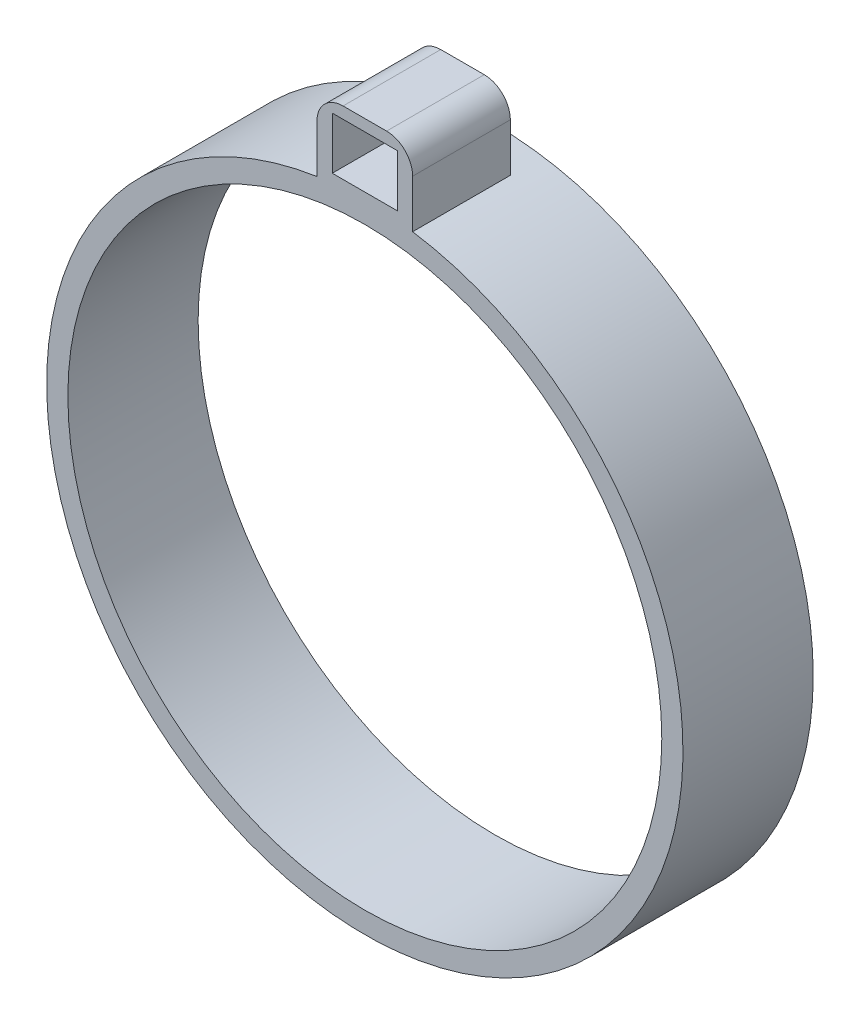
ISO-10303-21;
HEADER;
FILE_DESCRIPTION(('STEP AP214'),'2;1');
FILE_NAME('part.step','',(''),(''),'','','');
FILE_SCHEMA(('AUTOMOTIVE_DESIGN { 1 0 10303 214 1 1 1 1 }'));
ENDSEC;
DATA;
#1=APPLICATION_CONTEXT('core data for automotive mechanical design processes');
#2=APPLICATION_PROTOCOL_DEFINITION('international standard','automotive_design',2000,#1);
#3=PRODUCT_CONTEXT('',#1,'mechanical');
#4=PRODUCT('Part','Part','',(#3));
#5=PRODUCT_RELATED_PRODUCT_CATEGORY('part','',(#4));
#6=PRODUCT_DEFINITION_FORMATION('','',#4);
#7=PRODUCT_DEFINITION_CONTEXT('part definition',#1,'design');
#8=PRODUCT_DEFINITION('design','',#6,#7);
#9=PRODUCT_DEFINITION_SHAPE('','',#8);
#10=(LENGTH_UNIT() NAMED_UNIT(*) SI_UNIT(.MILLI.,.METRE.));
#11=(NAMED_UNIT(*) PLANE_ANGLE_UNIT() SI_UNIT($,.RADIAN.));
#12=(NAMED_UNIT(*) SI_UNIT($,.STERADIAN.) SOLID_ANGLE_UNIT());
#13=UNCERTAINTY_MEASURE_WITH_UNIT(LENGTH_MEASURE(1.E-05),#10,'distance_accuracy_value','');
#14=(GEOMETRIC_REPRESENTATION_CONTEXT(3) GLOBAL_UNCERTAINTY_ASSIGNED_CONTEXT((#13)) GLOBAL_UNIT_ASSIGNED_CONTEXT((#10,
#11,#12)) REPRESENTATION_CONTEXT('',''));
#15=CARTESIAN_POINT('',(0.,0.,0.));
#16=DIRECTION('',(0.,0.,1.));
#17=DIRECTION('',(1.,0.,0.));
#18=AXIS2_PLACEMENT_3D('',#15,#16,#17);
#19=CARTESIAN_POINT('',(0.,0.,10.));
#20=DIRECTION('',(0.,0.,1.));
#21=DIRECTION('',(1.,0.,0.));
#22=AXIS2_PLACEMENT_3D('',#19,#20,#21);
#23=PLANE('',#22);
#24=DIRECTION('',(0.,1.,0.));
#25=VECTOR('',#24,1.);
#26=CARTESIAN_POINT('',(7.34114069063274,59.6747669815585,10.));
#27=LINE('',#26,#25);
#28=CARTESIAN_POINT('',(7.34114069063274,48.2918476685585,10.));
#29=VERTEX_POINT('',#28);
#30=CARTESIAN_POINT('',(7.34114069063274,55.6747669815585,10.));
#31=VERTEX_POINT('',#30);
#32=EDGE_CURVE('E149',#29,#31,#27,.T.);
#33=ORIENTED_EDGE('',*,*,#32,.T.);
#34=CARTESIAN_POINT('',(3.34114069063274,55.6747669815585,10.));
#35=DIRECTION('',(0.,0.,1.));
#36=DIRECTION('',(1.,0.,0.));
#37=AXIS2_PLACEMENT_3D('',#34,#35,#36);
#38=CIRCLE('',#37,4.);
#39=CARTESIAN_POINT('',(3.34114069063274,59.6747669815585,10.));
#40=VERTEX_POINT('',#39);
#41=EDGE_CURVE('E193',#31,#40,#38,.T.);
#42=ORIENTED_EDGE('',*,*,#41,.T.);
#43=DIRECTION('',(-1.,0.,0.));
#44=VECTOR('',#43,1.);
#45=CARTESIAN_POINT('',(-7.34114069063274,59.6747669815585,10.));
#46=LINE('',#45,#44);
#47=CARTESIAN_POINT('',(-3.34114069063274,59.6747669815585,10.));
#48=VERTEX_POINT('',#47);
#49=EDGE_CURVE('E164',#40,#48,#46,.T.);
#50=ORIENTED_EDGE('',*,*,#49,.T.);
#51=CARTESIAN_POINT('',(-3.34114069063274,55.6747669815585,10.));
#52=DIRECTION('',(0.,0.,1.));
#53=DIRECTION('',(1.,0.,0.));
#54=AXIS2_PLACEMENT_3D('',#51,#52,#53);
#55=CIRCLE('',#54,4.);
#56=CARTESIAN_POINT('',(-7.34114069063274,55.6747669815585,10.));
#57=VERTEX_POINT('',#56);
#58=EDGE_CURVE('E191',#48,#57,#55,.T.);
#59=ORIENTED_EDGE('',*,*,#58,.T.);
#60=DIRECTION('',(0.,-1.,0.));
#61=VECTOR('',#60,1.);
#62=CARTESIAN_POINT('',(-7.34114069063274,59.6747669815585,10.));
#63=LINE('',#62,#61);
#64=CARTESIAN_POINT('',(-7.34114069063274,48.2918476685585,10.));
#65=VERTEX_POINT('',#64);
#66=EDGE_CURVE('E157',#57,#65,#63,.T.);
#67=ORIENTED_EDGE('',*,*,#66,.T.);
#68=CARTESIAN_POINT('',(0.,0.,10.));
#69=DIRECTION('',(0.,0.,1.));
#70=DIRECTION('',(1.,0.,0.));
#71=AXIS2_PLACEMENT_3D('',#68,#69,#70);
#72=CIRCLE('',#71,48.8466467414388);
#73=EDGE_CURVE('E174',#65,#29,#72,.T.);
#74=ORIENTED_EDGE('',*,*,#73,.T.);
#75=EDGE_LOOP('',(#33,#42,#50,#59,#67,#74));
#76=FACE_BOUND('',#75,.T.);
#77=CARTESIAN_POINT('',(0.,0.,10.));
#78=DIRECTION('',(0.,0.,1.));
#79=DIRECTION('',(1.,0.,0.));
#80=AXIS2_PLACEMENT_3D('',#77,#78,#79);
#81=CIRCLE('',#80,45.5930958457987);
#82=CARTESIAN_POINT('',(45.5930958457987,0.,10.));
#83=VERTEX_POINT('',#82);
#84=EDGE_CURVE('E168',#83,#83,#81,.T.);
#85=ORIENTED_EDGE('',*,*,#84,.F.);
#86=EDGE_LOOP('',(#85));
#87=FACE_BOUND('',#86,.T.);
#88=DIRECTION('',(0.,1.,0.));
#89=VECTOR('',#88,1.);
#90=CARTESIAN_POINT('',(4.99999999999999,57.8997684049065,10.));
#91=LINE('',#90,#89);
#92=CARTESIAN_POINT('',(5.,49.8997684049065,10.));
#93=VERTEX_POINT('',#92);
#94=CARTESIAN_POINT('',(4.99999999999999,57.8997684049065,10.));
#95=VERTEX_POINT('',#94);
#96=EDGE_CURVE('E117',#93,#95,#91,.T.);
#97=ORIENTED_EDGE('',*,*,#96,.F.);
#98=DIRECTION('',(1.,0.,0.));
#99=VECTOR('',#98,1.);
#100=CARTESIAN_POINT('',(-5.,49.8997684049065,10.));
#101=LINE('',#100,#99);
#102=CARTESIAN_POINT('',(-5.,49.8997684049065,10.));
#103=VERTEX_POINT('',#102);
#104=EDGE_CURVE('E134',#103,#93,#101,.T.);
#105=ORIENTED_EDGE('',*,*,#104,.F.);
#106=DIRECTION('',(0.,-1.,0.));
#107=VECTOR('',#106,1.);
#108=CARTESIAN_POINT('',(-5.,57.8997684049065,10.));
#109=LINE('',#108,#107);
#110=CARTESIAN_POINT('',(-5.,57.8997684049065,10.));
#111=VERTEX_POINT('',#110);
#112=EDGE_CURVE('E137',#111,#103,#109,.T.);
#113=ORIENTED_EDGE('',*,*,#112,.F.);
#114=DIRECTION('',(-1.,0.,0.));
#115=VECTOR('',#114,1.);
#116=CARTESIAN_POINT('',(-5.,57.8997684049065,10.));
#117=LINE('',#116,#115);
#118=EDGE_CURVE('E143',#95,#111,#117,.T.);
#119=ORIENTED_EDGE('',*,*,#118,.F.);
#120=EDGE_LOOP('',(#97,#105,#113,#119));
#121=FACE_BOUND('',#120,.T.);
#122=ADVANCED_FACE('F33',(#76,#87,#121),#23,.T.);
#123=CARTESIAN_POINT('',(0.,0.,-10.));
#124=DIRECTION('',(0.,0.,1.));
#125=DIRECTION('',(1.,0.,0.));
#126=AXIS2_PLACEMENT_3D('',#123,#124,#125);
#127=PLANE('',#126);
#128=CARTESIAN_POINT('',(0.,0.,-10.));
#129=DIRECTION('',(0.,0.,1.));
#130=DIRECTION('',(1.,0.,0.));
#131=AXIS2_PLACEMENT_3D('',#128,#129,#130);
#132=CIRCLE('',#131,48.8466467414388);
#133=CARTESIAN_POINT('',(48.8466467414388,0.,-10.));
#134=VERTEX_POINT('',#133);
#135=EDGE_CURVE('E171',#134,#134,#132,.T.);
#136=ORIENTED_EDGE('',*,*,#135,.F.);
#137=EDGE_LOOP('',(#136));
#138=FACE_BOUND('',#137,.T.);
#139=CARTESIAN_POINT('',(0.,0.,-10.));
#140=DIRECTION('',(0.,0.,1.));
#141=DIRECTION('',(1.,0.,0.));
#142=AXIS2_PLACEMENT_3D('',#139,#140,#141);
#143=CIRCLE('',#142,45.5930958457987);
#144=CARTESIAN_POINT('',(45.5930958457987,0.,-10.));
#145=VERTEX_POINT('',#144);
#146=EDGE_CURVE('E161',#145,#145,#143,.T.);
#147=ORIENTED_EDGE('',*,*,#146,.T.);
#148=EDGE_LOOP('',(#147));
#149=FACE_BOUND('',#148,.T.);
#150=ADVANCED_FACE('F224',(#138,#149),#127,.F.);
#151=CARTESIAN_POINT('',(0.,0.,10.));
#152=DIRECTION('',(0.,0.,-1.));
#153=DIRECTION('',(-1.,0.,0.));
#154=AXIS2_PLACEMENT_3D('',#151,#152,#153);
#155=CYLINDRICAL_SURFACE('',#154,48.8466467414388);
#156=CARTESIAN_POINT('',(0.,0.,-5.));
#157=DIRECTION('',(0.,0.,1.));
#158=DIRECTION('',(1.,0.,0.));
#159=AXIS2_PLACEMENT_3D('',#156,#157,#158);
#160=CIRCLE('',#159,48.8466467414388);
#161=CARTESIAN_POINT('',(7.34114069063274,48.2918476685585,-5.));
#162=VERTEX_POINT('',#161);
#163=CARTESIAN_POINT('',(-7.34114069063274,48.2918476685585,-5.));
#164=VERTEX_POINT('',#163);
#165=EDGE_CURVE('E177',#162,#164,#160,.T.);
#166=ORIENTED_EDGE('',*,*,#165,.F.);
#167=DIRECTION('',(0.,0.,-1.));
#168=VECTOR('',#167,1.);
#169=CARTESIAN_POINT('',(7.34114069063274,48.2918476685585,10.));
#170=LINE('',#169,#168);
#171=EDGE_CURVE('E185',#162,#29,#170,.F.);
#172=ORIENTED_EDGE('',*,*,#171,.T.);
#173=ORIENTED_EDGE('',*,*,#73,.F.);
#174=DIRECTION('',(0.,0.,-1.));
#175=VECTOR('',#174,1.);
#176=CARTESIAN_POINT('',(-7.34114069063274,48.2918476685585,10.));
#177=LINE('',#176,#175);
#178=EDGE_CURVE('E182',#65,#164,#177,.T.);
#179=ORIENTED_EDGE('',*,*,#178,.T.);
#180=EDGE_LOOP('',(#166,#172,#173,#179));
#181=FACE_BOUND('',#180,.T.);
#182=ORIENTED_EDGE('',*,*,#135,.T.);
#183=EDGE_LOOP('',(#182));
#184=FACE_BOUND('',#183,.T.);
#185=ADVANCED_FACE('F220',(#181,#184),#155,.T.);
#186=CARTESIAN_POINT('',(0.,0.,10.));
#187=DIRECTION('',(0.,0.,-1.));
#188=DIRECTION('',(-1.,0.,0.));
#189=AXIS2_PLACEMENT_3D('',#186,#187,#188);
#190=CYLINDRICAL_SURFACE('',#189,45.5930958457987);
#191=ORIENTED_EDGE('',*,*,#84,.T.);
#192=EDGE_LOOP('',(#191));
#193=FACE_BOUND('',#192,.T.);
#194=ORIENTED_EDGE('',*,*,#146,.F.);
#195=EDGE_LOOP('',(#194));
#196=FACE_BOUND('',#195,.T.);
#197=ADVANCED_FACE('F223',(#193,#196),#190,.F.);
#198=CARTESIAN_POINT('',(7.34114069063274,59.6747669815585,-5.));
#199=DIRECTION('',(1.,0.,0.));
#200=DIRECTION('',(0.,0.,-1.));
#201=AXIS2_PLACEMENT_3D('',#198,#199,#200);
#202=PLANE('',#201);
#203=DIRECTION('',(0.,1.,0.));
#204=VECTOR('',#203,1.);
#205=CARTESIAN_POINT('',(7.34114069063274,59.6747669815585,-5.));
#206=LINE('',#205,#204);
#207=CARTESIAN_POINT('',(7.34114069063274,55.6747669815585,-5.));
#208=VERTEX_POINT('',#207);
#209=EDGE_CURVE('E153',#162,#208,#206,.T.);
#210=ORIENTED_EDGE('',*,*,#209,.T.);
#211=DIRECTION('',(0.,0.,1.));
#212=VECTOR('',#211,1.);
#213=CARTESIAN_POINT('',(7.34114069063274,55.6747669815585,-5.));
#214=LINE('',#213,#212);
#215=EDGE_CURVE('E188',#208,#31,#214,.T.);
#216=ORIENTED_EDGE('',*,*,#215,.T.);
#217=ORIENTED_EDGE('',*,*,#32,.F.);
#218=ORIENTED_EDGE('',*,*,#171,.F.);
#219=EDGE_LOOP('',(#210,#216,#217,#218));
#220=FACE_BOUND('',#219,.T.);
#221=ADVANCED_FACE('F207',(#220),#202,.T.);
#222=CARTESIAN_POINT('',(-7.34114069063274,59.6747669815585,-5.));
#223=DIRECTION('',(-1.,0.,0.));
#224=DIRECTION('',(0.,0.,1.));
#225=AXIS2_PLACEMENT_3D('',#222,#223,#224);
#226=PLANE('',#225);
#227=ORIENTED_EDGE('',*,*,#66,.F.);
#228=DIRECTION('',(0.,0.,1.));
#229=VECTOR('',#228,1.);
#230=CARTESIAN_POINT('',(-7.34114069063274,55.6747669815585,-5.));
#231=LINE('',#230,#229);
#232=CARTESIAN_POINT('',(-7.34114069063274,55.6747669815585,-5.));
#233=VERTEX_POINT('',#232);
#234=EDGE_CURVE('E11',#57,#233,#231,.F.);
#235=ORIENTED_EDGE('',*,*,#234,.T.);
#236=DIRECTION('',(0.,-1.,0.));
#237=VECTOR('',#236,1.);
#238=CARTESIAN_POINT('',(-7.34114069063274,59.6747669815585,-5.));
#239=LINE('',#238,#237);
#240=EDGE_CURVE('E159',#233,#164,#239,.T.);
#241=ORIENTED_EDGE('',*,*,#240,.T.);
#242=ORIENTED_EDGE('',*,*,#178,.F.);
#243=EDGE_LOOP('',(#227,#235,#241,#242));
#244=FACE_BOUND('',#243,.T.);
#245=ADVANCED_FACE('F217',(#244),#226,.T.);
#246=CARTESIAN_POINT('',(-7.34114069063274,59.6747669815585,-5.));
#247=DIRECTION('',(0.,1.,0.));
#248=DIRECTION('',(0.,0.,1.));
#249=AXIS2_PLACEMENT_3D('',#246,#247,#248);
#250=PLANE('',#249);
#251=ORIENTED_EDGE('',*,*,#49,.F.);
#252=DIRECTION('',(0.,0.,1.));
#253=VECTOR('',#252,1.);
#254=CARTESIAN_POINT('',(3.34114069063274,59.6747669815585,-5.));
#255=LINE('',#254,#253);
#256=CARTESIAN_POINT('',(3.34114069063274,59.6747669815585,-5.));
#257=VERTEX_POINT('',#256);
#258=EDGE_CURVE('E198',#40,#257,#255,.F.);
#259=ORIENTED_EDGE('',*,*,#258,.T.);
#260=DIRECTION('',(-1.,0.,0.));
#261=VECTOR('',#260,1.);
#262=CARTESIAN_POINT('',(-7.34114069063274,59.6747669815585,-5.));
#263=LINE('',#262,#261);
#264=CARTESIAN_POINT('',(-3.34114069063274,59.6747669815585,-5.));
#265=VERTEX_POINT('',#264);
#266=EDGE_CURVE('E156',#257,#265,#263,.T.);
#267=ORIENTED_EDGE('',*,*,#266,.T.);
#268=DIRECTION('',(0.,0.,1.));
#269=VECTOR('',#268,1.);
#270=CARTESIAN_POINT('',(-3.34114069063274,59.6747669815585,-5.));
#271=LINE('',#270,#269);
#272=EDGE_CURVE('E195',#265,#48,#271,.T.);
#273=ORIENTED_EDGE('',*,*,#272,.T.);
#274=EDGE_LOOP('',(#251,#259,#267,#273));
#275=FACE_BOUND('',#274,.T.);
#276=ADVANCED_FACE('F213',(#275),#250,.T.);
#277=CARTESIAN_POINT('',(0.,0.,-5.));
#278=DIRECTION('',(0.,0.,1.));
#279=DIRECTION('',(1.,0.,0.));
#280=AXIS2_PLACEMENT_3D('',#277,#278,#279);
#281=PLANE('',#280);
#282=DIRECTION('',(1.,0.,0.));
#283=VECTOR('',#282,1.);
#284=CARTESIAN_POINT('',(-5.,49.8997684049065,-5.));
#285=LINE('',#284,#283);
#286=CARTESIAN_POINT('',(-5.,49.8997684049065,-5.));
#287=VERTEX_POINT('',#286);
#288=CARTESIAN_POINT('',(5.,49.8997684049065,-5.));
#289=VERTEX_POINT('',#288);
#290=EDGE_CURVE('E122',#287,#289,#285,.T.);
#291=ORIENTED_EDGE('',*,*,#290,.T.);
#292=DIRECTION('',(0.,1.,0.));
#293=VECTOR('',#292,1.);
#294=CARTESIAN_POINT('',(4.99999999999999,57.8997684049065,-5.));
#295=LINE('',#294,#293);
#296=CARTESIAN_POINT('',(4.99999999999999,57.8997684049065,-5.));
#297=VERTEX_POINT('',#296);
#298=EDGE_CURVE('E114',#289,#297,#295,.T.);
#299=ORIENTED_EDGE('',*,*,#298,.T.);
#300=DIRECTION('',(-1.,0.,0.));
#301=VECTOR('',#300,1.);
#302=CARTESIAN_POINT('',(-5.,57.8997684049065,-5.));
#303=LINE('',#302,#301);
#304=CARTESIAN_POINT('',(-5.,57.8997684049065,-5.));
#305=VERTEX_POINT('',#304);
#306=EDGE_CURVE('E126',#297,#305,#303,.T.);
#307=ORIENTED_EDGE('',*,*,#306,.T.);
#308=DIRECTION('',(0.,-1.,0.));
#309=VECTOR('',#308,1.);
#310=CARTESIAN_POINT('',(-5.,57.8997684049065,-5.));
#311=LINE('',#310,#309);
#312=EDGE_CURVE('E130',#305,#287,#311,.T.);
#313=ORIENTED_EDGE('',*,*,#312,.T.);
#314=EDGE_LOOP('',(#291,#299,#307,#313));
#315=FACE_BOUND('',#314,.T.);
#316=ORIENTED_EDGE('',*,*,#266,.F.);
#317=CARTESIAN_POINT('',(3.34114069063274,55.6747669815585,-5.));
#318=DIRECTION('',(0.,0.,1.));
#319=DIRECTION('',(1.,0.,0.));
#320=AXIS2_PLACEMENT_3D('',#317,#318,#319);
#321=CIRCLE('',#320,4.);
#322=EDGE_CURVE('E41',#257,#208,#321,.F.);
#323=ORIENTED_EDGE('',*,*,#322,.T.);
#324=ORIENTED_EDGE('',*,*,#209,.F.);
#325=ORIENTED_EDGE('',*,*,#165,.T.);
#326=ORIENTED_EDGE('',*,*,#240,.F.);
#327=CARTESIAN_POINT('',(-3.34114069063274,55.6747669815585,-5.));
#328=DIRECTION('',(0.,0.,1.));
#329=DIRECTION('',(1.,0.,0.));
#330=AXIS2_PLACEMENT_3D('',#327,#328,#329);
#331=CIRCLE('',#330,4.);
#332=EDGE_CURVE('E53',#233,#265,#331,.F.);
#333=ORIENTED_EDGE('',*,*,#332,.T.);
#334=EDGE_LOOP('',(#316,#323,#324,#325,#326,#333));
#335=FACE_BOUND('',#334,.T.);
#336=ADVANCED_FACE('F132',(#315,#335),#281,.F.);
#337=CARTESIAN_POINT('',(4.99999999999999,57.8997684049065,-5.));
#338=DIRECTION('',(1.,0.,0.));
#339=DIRECTION('',(0.,1.,0.));
#340=AXIS2_PLACEMENT_3D('',#337,#338,#339);
#341=PLANE('',#340);
#342=ORIENTED_EDGE('',*,*,#96,.T.);
#343=DIRECTION('',(0.,0.,1.));
#344=VECTOR('',#343,1.);
#345=CARTESIAN_POINT('',(4.99999999999999,57.8997684049065,-5.));
#346=LINE('',#345,#344);
#347=EDGE_CURVE('E110',#297,#95,#346,.T.);
#348=ORIENTED_EDGE('',*,*,#347,.F.);
#349=ORIENTED_EDGE('',*,*,#298,.F.);
#350=DIRECTION('',(0.,0.,1.));
#351=VECTOR('',#350,1.);
#352=CARTESIAN_POINT('',(5.,49.8997684049065,-5.));
#353=LINE('',#352,#351);
#354=EDGE_CURVE('E147',#289,#93,#353,.T.);
#355=ORIENTED_EDGE('',*,*,#354,.T.);
#356=EDGE_LOOP('',(#342,#348,#349,#355));
#357=FACE_BOUND('',#356,.T.);
#358=ADVANCED_FACE('F112',(#357),#341,.F.);
#359=CARTESIAN_POINT('',(-5.,49.8997684049065,-5.));
#360=DIRECTION('',(0.,-1.,0.));
#361=DIRECTION('',(0.,0.,-1.));
#362=AXIS2_PLACEMENT_3D('',#359,#360,#361);
#363=PLANE('',#362);
#364=ORIENTED_EDGE('',*,*,#104,.T.);
#365=ORIENTED_EDGE('',*,*,#354,.F.);
#366=ORIENTED_EDGE('',*,*,#290,.F.);
#367=DIRECTION('',(0.,0.,1.));
#368=VECTOR('',#367,1.);
#369=CARTESIAN_POINT('',(-5.,49.8997684049065,-5.));
#370=LINE('',#369,#368);
#371=EDGE_CURVE('E150',#287,#103,#370,.T.);
#372=ORIENTED_EDGE('',*,*,#371,.T.);
#373=EDGE_LOOP('',(#364,#365,#366,#372));
#374=FACE_BOUND('',#373,.T.);
#375=ADVANCED_FACE('F254',(#374),#363,.F.);
#376=CARTESIAN_POINT('',(-5.,57.8997684049065,-5.));
#377=DIRECTION('',(-1.,0.,0.));
#378=DIRECTION('',(0.,-1.,0.));
#379=AXIS2_PLACEMENT_3D('',#376,#377,#378);
#380=PLANE('',#379);
#381=ORIENTED_EDGE('',*,*,#112,.T.);
#382=ORIENTED_EDGE('',*,*,#371,.F.);
#383=ORIENTED_EDGE('',*,*,#312,.F.);
#384=DIRECTION('',(0.,0.,1.));
#385=VECTOR('',#384,1.);
#386=CARTESIAN_POINT('',(-5.,57.8997684049065,-5.));
#387=LINE('',#386,#385);
#388=EDGE_CURVE('E121',#305,#111,#387,.T.);
#389=ORIENTED_EDGE('',*,*,#388,.T.);
#390=EDGE_LOOP('',(#381,#382,#383,#389));
#391=FACE_BOUND('',#390,.T.);
#392=ADVANCED_FACE('F249',(#391),#380,.F.);
#393=CARTESIAN_POINT('',(-5.,57.8997684049065,-5.));
#394=DIRECTION('',(0.,1.,0.));
#395=DIRECTION('',(0.,0.,1.));
#396=AXIS2_PLACEMENT_3D('',#393,#394,#395);
#397=PLANE('',#396);
#398=ORIENTED_EDGE('',*,*,#118,.T.);
#399=ORIENTED_EDGE('',*,*,#388,.F.);
#400=ORIENTED_EDGE('',*,*,#306,.F.);
#401=ORIENTED_EDGE('',*,*,#347,.T.);
#402=EDGE_LOOP('',(#398,#399,#400,#401));
#403=FACE_BOUND('',#402,.T.);
#404=ADVANCED_FACE('F127',(#403),#397,.F.);
#405=CARTESIAN_POINT('',(3.34114069063274,55.6747669815585,-5.));
#406=DIRECTION('',(0.,0.,1.));
#407=DIRECTION('',(1.,0.,0.));
#408=AXIS2_PLACEMENT_3D('',#405,#406,#407);
#409=CYLINDRICAL_SURFACE('',#408,4.);
#410=ORIENTED_EDGE('',*,*,#322,.F.);
#411=ORIENTED_EDGE('',*,*,#258,.F.);
#412=ORIENTED_EDGE('',*,*,#41,.F.);
#413=ORIENTED_EDGE('',*,*,#215,.F.);
#414=EDGE_LOOP('',(#410,#411,#412,#413));
#415=FACE_BOUND('',#414,.T.);
#416=ADVANCED_FACE('F208',(#415),#409,.T.);
#417=CARTESIAN_POINT('',(-3.34114069063274,55.6747669815585,-5.));
#418=DIRECTION('',(0.,0.,1.));
#419=DIRECTION('',(1.,0.,0.));
#420=AXIS2_PLACEMENT_3D('',#417,#418,#419);
#421=CYLINDRICAL_SURFACE('',#420,4.);
#422=ORIENTED_EDGE('',*,*,#332,.F.);
#423=ORIENTED_EDGE('',*,*,#234,.F.);
#424=ORIENTED_EDGE('',*,*,#58,.F.);
#425=ORIENTED_EDGE('',*,*,#272,.F.);
#426=EDGE_LOOP('',(#422,#423,#424,#425));
#427=FACE_BOUND('',#426,.T.);
#428=ADVANCED_FACE('F35',(#427),#421,.T.);
#429=CLOSED_SHELL('',(#122,#150,#185,#197,#221,#245,#276,#336,#358,#375,#392,#404,#416,#428));
#430=MANIFOLD_SOLID_BREP('B2',#429);
#431=ADVANCED_BREP_SHAPE_REPRESENTATION('',(#18,#430),#14);
#432=SHAPE_DEFINITION_REPRESENTATION(#9,#431);
ENDSEC;
END-ISO-10303-21;
